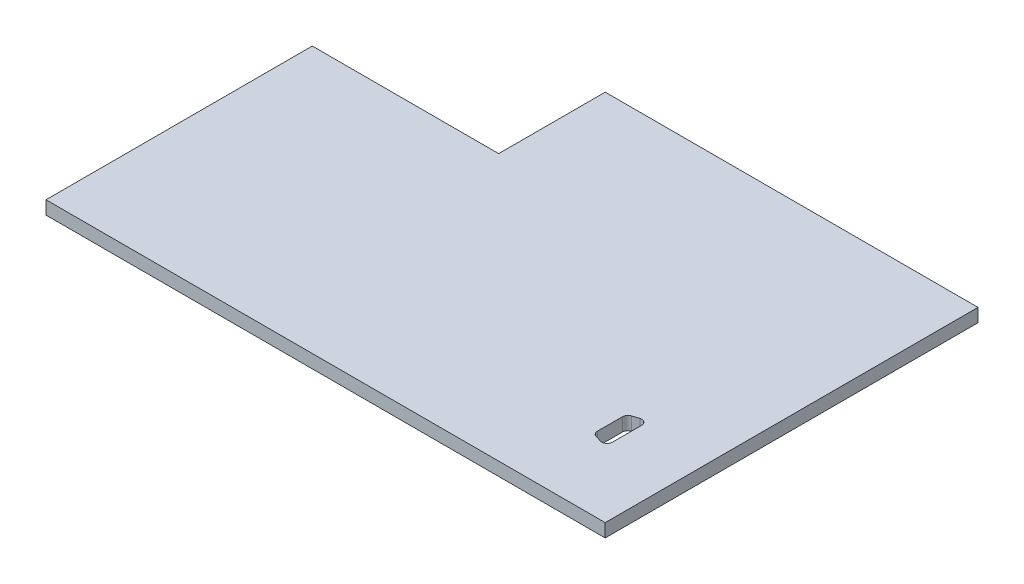
ISO-10303-21;
HEADER;
FILE_DESCRIPTION(('STEP AP214'),'2;1');
FILE_NAME('part.step','',(''),(''),'','','');
FILE_SCHEMA(('AUTOMOTIVE_DESIGN { 1 0 10303 214 1 1 1 1 }'));
ENDSEC;
DATA;
#1=APPLICATION_CONTEXT('core data for automotive mechanical design processes');
#2=APPLICATION_PROTOCOL_DEFINITION('international standard','automotive_design',2000,#1);
#3=PRODUCT_CONTEXT('',#1,'mechanical');
#4=PRODUCT('Part','Part','',(#3));
#5=PRODUCT_RELATED_PRODUCT_CATEGORY('part','',(#4));
#6=PRODUCT_DEFINITION_FORMATION('','',#4);
#7=PRODUCT_DEFINITION_CONTEXT('part definition',#1,'design');
#8=PRODUCT_DEFINITION('design','',#6,#7);
#9=PRODUCT_DEFINITION_SHAPE('','',#8);
#10=(LENGTH_UNIT() NAMED_UNIT(*) SI_UNIT(.MILLI.,.METRE.));
#11=(NAMED_UNIT(*) PLANE_ANGLE_UNIT() SI_UNIT($,.RADIAN.));
#12=(NAMED_UNIT(*) SI_UNIT($,.STERADIAN.) SOLID_ANGLE_UNIT());
#13=UNCERTAINTY_MEASURE_WITH_UNIT(LENGTH_MEASURE(1.E-05),#10,'distance_accuracy_value','');
#14=(GEOMETRIC_REPRESENTATION_CONTEXT(3) GLOBAL_UNCERTAINTY_ASSIGNED_CONTEXT((#13)) GLOBAL_UNIT_ASSIGNED_CONTEXT((#10,
#11,#12)) REPRESENTATION_CONTEXT('',''));
#15=CARTESIAN_POINT('',(0.,0.,0.));
#16=DIRECTION('',(0.,0.,1.));
#17=DIRECTION('',(1.,0.,0.));
#18=AXIS2_PLACEMENT_3D('',#15,#16,#17);
#19=CARTESIAN_POINT('',(266.7,6.35,0.));
#20=DIRECTION('',(0.,0.,-1.));
#21=DIRECTION('',(-1.,0.,0.));
#22=AXIS2_PLACEMENT_3D('',#19,#20,#21);
#23=PLANE('',#22);
#24=DIRECTION('',(1.,0.,0.));
#25=VECTOR('',#24,1.);
#26=CARTESIAN_POINT('',(266.7,0.,0.));
#27=LINE('',#26,#25);
#28=CARTESIAN_POINT('',(0.,0.,0.));
#29=VERTEX_POINT('',#28);
#30=CARTESIAN_POINT('',(266.7,0.,0.));
#31=VERTEX_POINT('',#30);
#32=EDGE_CURVE('E207',#29,#31,#27,.T.);
#33=ORIENTED_EDGE('',*,*,#32,.T.);
#34=DIRECTION('',(0.,-1.,0.));
#35=VECTOR('',#34,1.);
#36=CARTESIAN_POINT('',(266.7,6.35,0.));
#37=LINE('',#36,#35);
#38=CARTESIAN_POINT('',(266.7,6.35,0.));
#39=VERTEX_POINT('',#38);
#40=EDGE_CURVE('E255',#39,#31,#37,.T.);
#41=ORIENTED_EDGE('',*,*,#40,.F.);
#42=DIRECTION('',(1.,0.,0.));
#43=VECTOR('',#42,1.);
#44=CARTESIAN_POINT('',(266.7,6.35,0.));
#45=LINE('',#44,#43);
#46=CARTESIAN_POINT('',(0.,6.35,0.));
#47=VERTEX_POINT('',#46);
#48=EDGE_CURVE('E215',#47,#39,#45,.T.);
#49=ORIENTED_EDGE('',*,*,#48,.F.);
#50=DIRECTION('',(0.,-1.,0.));
#51=VECTOR('',#50,1.);
#52=CARTESIAN_POINT('',(0.,6.35,0.));
#53=LINE('',#52,#51);
#54=EDGE_CURVE('E229',#47,#29,#53,.T.);
#55=ORIENTED_EDGE('',*,*,#54,.T.);
#56=EDGE_LOOP('',(#33,#41,#49,#55));
#57=FACE_BOUND('',#56,.T.);
#58=ADVANCED_FACE('F33',(#57),#23,.F.);
#59=CARTESIAN_POINT('',(266.7,6.35,-177.8));
#60=DIRECTION('',(-1.,0.,0.));
#61=DIRECTION('',(0.,0.,1.));
#62=AXIS2_PLACEMENT_3D('',#59,#60,#61);
#63=PLANE('',#62);
#64=DIRECTION('',(0.,0.,-1.));
#65=VECTOR('',#64,1.);
#66=CARTESIAN_POINT('',(266.7,0.,-177.8));
#67=LINE('',#66,#65);
#68=CARTESIAN_POINT('',(266.7,0.,-177.8));
#69=VERTEX_POINT('',#68);
#70=EDGE_CURVE('E232',#31,#69,#67,.T.);
#71=ORIENTED_EDGE('',*,*,#70,.T.);
#72=DIRECTION('',(0.,-1.,0.));
#73=VECTOR('',#72,1.);
#74=CARTESIAN_POINT('',(266.7,6.35,-177.8));
#75=LINE('',#74,#73);
#76=CARTESIAN_POINT('',(266.7,6.35,-177.8));
#77=VERTEX_POINT('',#76);
#78=EDGE_CURVE('E252',#77,#69,#75,.T.);
#79=ORIENTED_EDGE('',*,*,#78,.F.);
#80=DIRECTION('',(0.,0.,-1.));
#81=VECTOR('',#80,1.);
#82=CARTESIAN_POINT('',(266.7,6.35,-177.8));
#83=LINE('',#82,#81);
#84=EDGE_CURVE('E218',#39,#77,#83,.T.);
#85=ORIENTED_EDGE('',*,*,#84,.F.);
#86=ORIENTED_EDGE('',*,*,#40,.T.);
#87=EDGE_LOOP('',(#71,#79,#85,#86));
#88=FACE_BOUND('',#87,.T.);
#89=ADVANCED_FACE('F331',(#88),#63,.F.);
#90=CARTESIAN_POINT('',(88.9,6.35,-177.8));
#91=DIRECTION('',(0.,0.,1.));
#92=DIRECTION('',(1.,0.,0.));
#93=AXIS2_PLACEMENT_3D('',#90,#91,#92);
#94=PLANE('',#93);
#95=DIRECTION('',(-1.,0.,0.));
#96=VECTOR('',#95,1.);
#97=CARTESIAN_POINT('',(88.9,0.,-177.8));
#98=LINE('',#97,#96);
#99=CARTESIAN_POINT('',(88.9,0.,-177.8));
#100=VERTEX_POINT('',#99);
#101=EDGE_CURVE('E234',#69,#100,#98,.T.);
#102=ORIENTED_EDGE('',*,*,#101,.T.);
#103=DIRECTION('',(0.,-1.,0.));
#104=VECTOR('',#103,1.);
#105=CARTESIAN_POINT('',(88.9,6.35,-177.8));
#106=LINE('',#105,#104);
#107=CARTESIAN_POINT('',(88.9,6.35,-177.8));
#108=VERTEX_POINT('',#107);
#109=EDGE_CURVE('E249',#108,#100,#106,.T.);
#110=ORIENTED_EDGE('',*,*,#109,.F.);
#111=DIRECTION('',(-1.,0.,0.));
#112=VECTOR('',#111,1.);
#113=CARTESIAN_POINT('',(88.9,6.35,-177.8));
#114=LINE('',#113,#112);
#115=EDGE_CURVE('E221',#77,#108,#114,.T.);
#116=ORIENTED_EDGE('',*,*,#115,.F.);
#117=ORIENTED_EDGE('',*,*,#78,.T.);
#118=EDGE_LOOP('',(#102,#110,#116,#117));
#119=FACE_BOUND('',#118,.T.);
#120=ADVANCED_FACE('F337',(#119),#94,.F.);
#121=CARTESIAN_POINT('',(88.9,6.35,-127.));
#122=DIRECTION('',(1.,0.,0.));
#123=DIRECTION('',(0.,0.,-1.));
#124=AXIS2_PLACEMENT_3D('',#121,#122,#123);
#125=PLANE('',#124);
#126=DIRECTION('',(0.,0.,1.));
#127=VECTOR('',#126,1.);
#128=CARTESIAN_POINT('',(88.9,0.,-127.));
#129=LINE('',#128,#127);
#130=CARTESIAN_POINT('',(88.9,0.,-158.75));
#131=VERTEX_POINT('',#130);
#132=EDGE_CURVE('E236',#100,#131,#129,.T.);
#133=ORIENTED_EDGE('',*,*,#132,.T.);
#134=DIRECTION('',(0.,1.,0.));
#135=VECTOR('',#134,1.);
#136=CARTESIAN_POINT('',(88.9,-5.08,-158.75));
#137=LINE('',#136,#135);
#138=CARTESIAN_POINT('',(88.9,-5.08,-158.75));
#139=VERTEX_POINT('',#138);
#140=EDGE_CURVE('E208',#139,#131,#137,.T.);
#141=ORIENTED_EDGE('',*,*,#140,.F.);
#142=DIRECTION('',(0.,0.,1.));
#143=VECTOR('',#142,1.);
#144=CARTESIAN_POINT('',(88.9,-5.08,-127.));
#145=LINE('',#144,#143);
#146=CARTESIAN_POINT('',(88.9,-5.08,-127.));
#147=VERTEX_POINT('',#146);
#148=EDGE_CURVE('E202',#139,#147,#145,.T.);
#149=ORIENTED_EDGE('',*,*,#148,.T.);
#150=DIRECTION('',(0.,-1.,0.));
#151=VECTOR('',#150,1.);
#152=CARTESIAN_POINT('',(88.9,6.35,-127.));
#153=LINE('',#152,#151);
#154=CARTESIAN_POINT('',(88.9,6.35,-127.));
#155=VERTEX_POINT('',#154);
#156=EDGE_CURVE('E247',#155,#147,#153,.T.);
#157=ORIENTED_EDGE('',*,*,#156,.F.);
#158=DIRECTION('',(0.,0.,1.));
#159=VECTOR('',#158,1.);
#160=CARTESIAN_POINT('',(88.9,6.35,-127.));
#161=LINE('',#160,#159);
#162=EDGE_CURVE('E223',#108,#155,#161,.T.);
#163=ORIENTED_EDGE('',*,*,#162,.F.);
#164=ORIENTED_EDGE('',*,*,#109,.T.);
#165=EDGE_LOOP('',(#133,#141,#149,#157,#163,#164));
#166=FACE_BOUND('',#165,.T.);
#167=ADVANCED_FACE('F406',(#166),#125,.F.);
#168=CARTESIAN_POINT('',(0.,6.35,-127.));
#169=DIRECTION('',(0.,0.,1.));
#170=DIRECTION('',(1.,0.,0.));
#171=AXIS2_PLACEMENT_3D('',#168,#169,#170);
#172=PLANE('',#171);
#173=DIRECTION('',(0.,-1.,0.));
#174=VECTOR('',#173,1.);
#175=CARTESIAN_POINT('',(0.,6.35,-127.));
#176=LINE('',#175,#174);
#177=CARTESIAN_POINT('',(0.,6.35,-127.));
#178=VERTEX_POINT('',#177);
#179=CARTESIAN_POINT('',(0.,0.,-127.));
#180=VERTEX_POINT('',#179);
#181=EDGE_CURVE('E244',#178,#180,#176,.T.);
#182=ORIENTED_EDGE('',*,*,#181,.F.);
#183=DIRECTION('',(-1.,0.,0.));
#184=VECTOR('',#183,1.);
#185=CARTESIAN_POINT('',(0.,6.35,-127.));
#186=LINE('',#185,#184);
#187=EDGE_CURVE('E225',#155,#178,#186,.T.);
#188=ORIENTED_EDGE('',*,*,#187,.F.);
#189=ORIENTED_EDGE('',*,*,#156,.T.);
#190=DIRECTION('',(-1.,0.,0.));
#191=VECTOR('',#190,1.);
#192=CARTESIAN_POINT('',(19.05,-5.08,-127.));
#193=LINE('',#192,#191);
#194=CARTESIAN_POINT('',(19.05,-5.08,-127.));
#195=VERTEX_POINT('',#194);
#196=EDGE_CURVE('E175',#147,#195,#193,.T.);
#197=ORIENTED_EDGE('',*,*,#196,.T.);
#198=DIRECTION('',(0.,1.,0.));
#199=VECTOR('',#198,1.);
#200=CARTESIAN_POINT('',(19.05,-5.08,-127.));
#201=LINE('',#200,#199);
#202=CARTESIAN_POINT('',(19.05,0.,-127.));
#203=VERTEX_POINT('',#202);
#204=EDGE_CURVE('E190',#195,#203,#201,.T.);
#205=ORIENTED_EDGE('',*,*,#204,.T.);
#206=DIRECTION('',(-1.,0.,0.));
#207=VECTOR('',#206,1.);
#208=CARTESIAN_POINT('',(0.,0.,-127.));
#209=LINE('',#208,#207);
#210=EDGE_CURVE('E239',#203,#180,#209,.T.);
#211=ORIENTED_EDGE('',*,*,#210,.T.);
#212=EDGE_LOOP('',(#182,#188,#189,#197,#205,#211));
#213=FACE_BOUND('',#212,.T.);
#214=ADVANCED_FACE('F402',(#213),#172,.F.);
#215=CARTESIAN_POINT('',(0.,6.35,0.));
#216=DIRECTION('',(1.,0.,0.));
#217=DIRECTION('',(0.,0.,-1.));
#218=AXIS2_PLACEMENT_3D('',#215,#216,#217);
#219=PLANE('',#218);
#220=DIRECTION('',(0.,0.,1.));
#221=VECTOR('',#220,1.);
#222=CARTESIAN_POINT('',(0.,0.,0.));
#223=LINE('',#222,#221);
#224=EDGE_CURVE('E219',#180,#29,#223,.T.);
#225=ORIENTED_EDGE('',*,*,#224,.T.);
#226=ORIENTED_EDGE('',*,*,#54,.F.);
#227=DIRECTION('',(0.,0.,1.));
#228=VECTOR('',#227,1.);
#229=CARTESIAN_POINT('',(0.,6.35,0.));
#230=LINE('',#229,#228);
#231=EDGE_CURVE('E227',#178,#47,#230,.T.);
#232=ORIENTED_EDGE('',*,*,#231,.F.);
#233=ORIENTED_EDGE('',*,*,#181,.T.);
#234=EDGE_LOOP('',(#225,#226,#232,#233));
#235=FACE_BOUND('',#234,.T.);
#236=ADVANCED_FACE('F397',(#235),#219,.F.);
#237=CARTESIAN_POINT('',(0.,6.35,0.));
#238=DIRECTION('',(0.,-1.,0.));
#239=DIRECTION('',(0.,0.,-1.));
#240=AXIS2_PLACEMENT_3D('',#237,#238,#239);
#241=PLANE('',#240);
#242=DIRECTION('',(0.,0.,-1.));
#243=VECTOR('',#242,1.);
#244=CARTESIAN_POINT('',(235.204,6.35,-31.496));
#245=LINE('',#244,#243);
#246=CARTESIAN_POINT('',(235.204,6.35,-34.9508849200106));
#247=VERTEX_POINT('',#246);
#248=CARTESIAN_POINT('',(235.204,6.35,-48.8691150799894));
#249=VERTEX_POINT('',#248);
#250=EDGE_CURVE('E355',#247,#249,#245,.T.);
#251=ORIENTED_EDGE('',*,*,#250,.F.);
#252=CARTESIAN_POINT('',(232.664,6.35,-34.9508849200106));
#253=DIRECTION('',(0.,-1.,0.));
#254=DIRECTION('',(0.,0.,-1.));
#255=AXIS2_PLACEMENT_3D('',#252,#253,#254);
#256=CIRCLE('',#255,2.54);
#257=CARTESIAN_POINT('',(231.906381517435,6.35,-32.5265057758017));
#258=VERTEX_POINT('',#257);
#259=EDGE_CURVE('E298',#247,#258,#256,.T.);
#260=ORIENTED_EDGE('',*,*,#259,.T.);
#261=DIRECTION('',(0.95447997803503,0.,0.298274993135947));
#262=VECTOR('',#261,1.);
#263=CARTESIAN_POINT('',(227.076,6.35,-34.036));
#264=LINE('',#263,#262);
#265=CARTESIAN_POINT('',(228.858381517435,6.35,-33.4790057758017));
#266=VERTEX_POINT('',#265);
#267=EDGE_CURVE('E356',#266,#258,#264,.T.);
#268=ORIENTED_EDGE('',*,*,#267,.F.);
#269=CARTESIAN_POINT('',(229.616,6.35,-35.9033849200106));
#270=DIRECTION('',(0.,-1.,0.));
#271=DIRECTION('',(0.,0.,-1.));
#272=AXIS2_PLACEMENT_3D('',#269,#270,#271);
#273=CIRCLE('',#272,2.54);
#274=CARTESIAN_POINT('',(227.076,6.35,-35.9033849200106));
#275=VERTEX_POINT('',#274);
#276=EDGE_CURVE('E302',#266,#275,#273,.T.);
#277=ORIENTED_EDGE('',*,*,#276,.T.);
#278=DIRECTION('',(0.,0.,1.));
#279=VECTOR('',#278,1.);
#280=CARTESIAN_POINT('',(227.076,6.35,-49.784));
#281=LINE('',#280,#279);
#282=CARTESIAN_POINT('',(227.076,6.35,-47.9166150799894));
#283=VERTEX_POINT('',#282);
#284=EDGE_CURVE('E191',#283,#275,#281,.T.);
#285=ORIENTED_EDGE('',*,*,#284,.F.);
#286=CARTESIAN_POINT('',(229.616,6.35,-47.9166150799894));
#287=DIRECTION('',(0.,-1.,0.));
#288=DIRECTION('',(0.,0.,-1.));
#289=AXIS2_PLACEMENT_3D('',#286,#287,#288);
#290=CIRCLE('',#289,2.54);
#291=CARTESIAN_POINT('',(228.858381517435,6.35,-50.3409942241983));
#292=VERTEX_POINT('',#291);
#293=EDGE_CURVE('E41',#283,#292,#290,.T.);
#294=ORIENTED_EDGE('',*,*,#293,.T.);
#295=DIRECTION('',(-0.95447997803503,0.,0.298274993135947));
#296=VECTOR('',#295,1.);
#297=CARTESIAN_POINT('',(235.204,6.35,-52.324));
#298=LINE('',#297,#296);
#299=CARTESIAN_POINT('',(231.906381517435,6.35,-51.2934942241983));
#300=VERTEX_POINT('',#299);
#301=EDGE_CURVE('E194',#300,#292,#298,.T.);
#302=ORIENTED_EDGE('',*,*,#301,.F.);
#303=CARTESIAN_POINT('',(232.664,6.35,-48.8691150799894));
#304=DIRECTION('',(0.,-1.,0.));
#305=DIRECTION('',(0.,0.,-1.));
#306=AXIS2_PLACEMENT_3D('',#303,#304,#305);
#307=CIRCLE('',#306,2.54);
#308=EDGE_CURVE('E55',#300,#249,#307,.T.);
#309=ORIENTED_EDGE('',*,*,#308,.T.);
#310=EDGE_LOOP('',(#251,#260,#268,#277,#285,#294,#302,#309));
#311=FACE_BOUND('',#310,.T.);
#312=ORIENTED_EDGE('',*,*,#187,.T.);
#313=ORIENTED_EDGE('',*,*,#231,.T.);
#314=ORIENTED_EDGE('',*,*,#48,.T.);
#315=ORIENTED_EDGE('',*,*,#84,.T.);
#316=ORIENTED_EDGE('',*,*,#115,.T.);
#317=ORIENTED_EDGE('',*,*,#162,.T.);
#318=EDGE_LOOP('',(#312,#313,#314,#315,#316,#317));
#319=FACE_BOUND('',#318,.T.);
#320=ADVANCED_FACE('F364',(#311,#319),#241,.F.);
#321=CARTESIAN_POINT('',(0.,0.,0.));
#322=DIRECTION('',(0.,-1.,0.));
#323=DIRECTION('',(0.,0.,-1.));
#324=AXIS2_PLACEMENT_3D('',#321,#322,#323);
#325=PLANE('',#324);
#326=DIRECTION('',(-0.95447997803503,0.,-0.298274993135947));
#327=VECTOR('',#326,1.);
#328=CARTESIAN_POINT('',(29.8924555160143,0.,-95.6558576512456));
#329=LINE('',#328,#327);
#330=CARTESIAN_POINT('',(231.906381517435,0.,-32.5265057758017));
#331=VERTEX_POINT('',#330);
#332=CARTESIAN_POINT('',(228.858381517435,0.,-33.4790057758017));
#333=VERTEX_POINT('',#332);
#334=EDGE_CURVE('E276',#331,#333,#329,.T.);
#335=ORIENTED_EDGE('',*,*,#334,.F.);
#336=CARTESIAN_POINT('',(232.664,0.,-34.9508849200106));
#337=DIRECTION('',(0.,-1.,0.));
#338=DIRECTION('',(0.,0.,-1.));
#339=AXIS2_PLACEMENT_3D('',#336,#337,#338);
#340=CIRCLE('',#339,2.54);
#341=CARTESIAN_POINT('',(235.204,0.,-34.9508849200106));
#342=VERTEX_POINT('',#341);
#343=EDGE_CURVE('E300',#331,#342,#340,.F.);
#344=ORIENTED_EDGE('',*,*,#343,.T.);
#345=DIRECTION('',(0.,0.,1.));
#346=VECTOR('',#345,1.);
#347=CARTESIAN_POINT('',(235.204,0.,0.));
#348=LINE('',#347,#346);
#349=CARTESIAN_POINT('',(235.204,0.,-48.8691150799894));
#350=VERTEX_POINT('',#349);
#351=EDGE_CURVE('E267',#350,#342,#348,.T.);
#352=ORIENTED_EDGE('',*,*,#351,.F.);
#353=CARTESIAN_POINT('',(232.664,0.,-48.8691150799894));
#354=DIRECTION('',(0.,-1.,0.));
#355=DIRECTION('',(0.,0.,-1.));
#356=AXIS2_PLACEMENT_3D('',#353,#354,#355);
#357=CIRCLE('',#356,2.54);
#358=CARTESIAN_POINT('',(231.906381517435,0.,-51.2934942241983));
#359=VERTEX_POINT('',#358);
#360=EDGE_CURVE('E307',#350,#359,#357,.F.);
#361=ORIENTED_EDGE('',*,*,#360,.T.);
#362=DIRECTION('',(0.95447997803503,0.,-0.298274993135947));
#363=VECTOR('',#362,1.);
#364=CARTESIAN_POINT('',(6.02911032028472,0.,19.2931530249111));
#365=LINE('',#364,#363);
#366=CARTESIAN_POINT('',(228.858381517435,0.,-50.3409942241983));
#367=VERTEX_POINT('',#366);
#368=EDGE_CURVE('E270',#367,#359,#365,.T.);
#369=ORIENTED_EDGE('',*,*,#368,.F.);
#370=CARTESIAN_POINT('',(229.616,0.,-47.9166150799894));
#371=DIRECTION('',(0.,-1.,0.));
#372=DIRECTION('',(0.,0.,-1.));
#373=AXIS2_PLACEMENT_3D('',#370,#371,#372);
#374=CIRCLE('',#373,2.54);
#375=CARTESIAN_POINT('',(227.076,0.,-47.9166150799894));
#376=VERTEX_POINT('',#375);
#377=EDGE_CURVE('E11',#367,#376,#374,.F.);
#378=ORIENTED_EDGE('',*,*,#377,.T.);
#379=DIRECTION('',(0.,0.,-1.));
#380=VECTOR('',#379,1.);
#381=CARTESIAN_POINT('',(227.076,0.,0.));
#382=LINE('',#381,#380);
#383=CARTESIAN_POINT('',(227.076,0.,-35.9033849200106));
#384=VERTEX_POINT('',#383);
#385=EDGE_CURVE('E273',#384,#376,#382,.T.);
#386=ORIENTED_EDGE('',*,*,#385,.F.);
#387=CARTESIAN_POINT('',(229.616,0.,-35.9033849200106));
#388=DIRECTION('',(0.,-1.,0.));
#389=DIRECTION('',(0.,0.,-1.));
#390=AXIS2_PLACEMENT_3D('',#387,#388,#389);
#391=CIRCLE('',#390,2.54);
#392=EDGE_CURVE('E304',#384,#333,#391,.F.);
#393=ORIENTED_EDGE('',*,*,#392,.T.);
#394=EDGE_LOOP('',(#335,#344,#352,#361,#369,#378,#386,#393));
#395=FACE_BOUND('',#394,.T.);
#396=DIRECTION('',(0.,0.,-1.));
#397=VECTOR('',#396,1.);
#398=CARTESIAN_POINT('',(19.05,0.,0.));
#399=LINE('',#398,#397);
#400=CARTESIAN_POINT('',(19.05,0.,-114.3));
#401=VERTEX_POINT('',#400);
#402=EDGE_CURVE('E265',#401,#203,#399,.T.);
#403=ORIENTED_EDGE('',*,*,#402,.F.);
#404=DIRECTION('',(-1.,0.,0.));
#405=VECTOR('',#404,1.);
#406=CARTESIAN_POINT('',(0.,0.,-114.3));
#407=LINE('',#406,#405);
#408=CARTESIAN_POINT('',(101.6,0.,-114.3));
#409=VERTEX_POINT('',#408);
#410=EDGE_CURVE('E170',#409,#401,#407,.T.);
#411=ORIENTED_EDGE('',*,*,#410,.F.);
#412=DIRECTION('',(0.,0.,1.));
#413=VECTOR('',#412,1.);
#414=CARTESIAN_POINT('',(101.6,0.,0.));
#415=LINE('',#414,#413);
#416=CARTESIAN_POINT('',(101.6,0.,-158.75));
#417=VERTEX_POINT('',#416);
#418=EDGE_CURVE('E259',#417,#409,#415,.T.);
#419=ORIENTED_EDGE('',*,*,#418,.F.);
#420=DIRECTION('',(1.,0.,0.));
#421=VECTOR('',#420,1.);
#422=CARTESIAN_POINT('',(0.,0.,-158.75));
#423=LINE('',#422,#421);
#424=EDGE_CURVE('E262',#131,#417,#423,.T.);
#425=ORIENTED_EDGE('',*,*,#424,.F.);
#426=ORIENTED_EDGE('',*,*,#132,.F.);
#427=ORIENTED_EDGE('',*,*,#101,.F.);
#428=ORIENTED_EDGE('',*,*,#70,.F.);
#429=ORIENTED_EDGE('',*,*,#32,.F.);
#430=ORIENTED_EDGE('',*,*,#224,.F.);
#431=ORIENTED_EDGE('',*,*,#210,.F.);
#432=EDGE_LOOP('',(#403,#411,#419,#425,#426,#427,#428,#429,#430,#431));
#433=FACE_BOUND('',#432,.T.);
#434=ADVANCED_FACE('F313',(#395,#433),#325,.T.);
#435=CARTESIAN_POINT('',(19.05,-5.08,-114.3));
#436=DIRECTION('',(-1.,0.,0.));
#437=DIRECTION('',(0.,0.,1.));
#438=AXIS2_PLACEMENT_3D('',#435,#436,#437);
#439=PLANE('',#438);
#440=DIRECTION('',(0.,1.,0.));
#441=VECTOR('',#440,1.);
#442=CARTESIAN_POINT('',(19.05,-5.08,-114.3));
#443=LINE('',#442,#441);
#444=CARTESIAN_POINT('',(19.05,-5.08,-114.3));
#445=VERTEX_POINT('',#444);
#446=EDGE_CURVE('E165',#445,#401,#443,.T.);
#447=ORIENTED_EDGE('',*,*,#446,.T.);
#448=ORIENTED_EDGE('',*,*,#402,.T.);
#449=ORIENTED_EDGE('',*,*,#204,.F.);
#450=DIRECTION('',(0.,0.,1.));
#451=VECTOR('',#450,1.);
#452=CARTESIAN_POINT('',(19.05,-5.08,-114.3));
#453=LINE('',#452,#451);
#454=EDGE_CURVE('E182',#195,#445,#453,.T.);
#455=ORIENTED_EDGE('',*,*,#454,.T.);
#456=EDGE_LOOP('',(#447,#448,#449,#455));
#457=FACE_BOUND('',#456,.T.);
#458=ADVANCED_FACE('F188',(#457),#439,.T.);
#459=CARTESIAN_POINT('',(88.9,-5.08,-158.75));
#460=DIRECTION('',(0.,0.,-1.));
#461=DIRECTION('',(-1.,0.,0.));
#462=AXIS2_PLACEMENT_3D('',#459,#460,#461);
#463=PLANE('',#462);
#464=ORIENTED_EDGE('',*,*,#140,.T.);
#465=ORIENTED_EDGE('',*,*,#424,.T.);
#466=DIRECTION('',(0.,1.,0.));
#467=VECTOR('',#466,1.);
#468=CARTESIAN_POINT('',(101.6,-5.08,-158.75));
#469=LINE('',#468,#467);
#470=CARTESIAN_POINT('',(101.6,-5.08,-158.75));
#471=VERTEX_POINT('',#470);
#472=EDGE_CURVE('E211',#471,#417,#469,.T.);
#473=ORIENTED_EDGE('',*,*,#472,.F.);
#474=DIRECTION('',(-1.,0.,0.));
#475=VECTOR('',#474,1.);
#476=CARTESIAN_POINT('',(88.9,-5.08,-158.75));
#477=LINE('',#476,#475);
#478=EDGE_CURVE('E199',#471,#139,#477,.T.);
#479=ORIENTED_EDGE('',*,*,#478,.T.);
#480=EDGE_LOOP('',(#464,#465,#473,#479));
#481=FACE_BOUND('',#480,.T.);
#482=ADVANCED_FACE('F383',(#481),#463,.T.);
#483=CARTESIAN_POINT('',(101.6,-5.08,-114.3));
#484=DIRECTION('',(1.,0.,0.));
#485=DIRECTION('',(0.,0.,-1.));
#486=AXIS2_PLACEMENT_3D('',#483,#484,#485);
#487=PLANE('',#486);
#488=ORIENTED_EDGE('',*,*,#472,.T.);
#489=ORIENTED_EDGE('',*,*,#418,.T.);
#490=DIRECTION('',(0.,1.,0.));
#491=VECTOR('',#490,1.);
#492=CARTESIAN_POINT('',(101.6,-5.08,-114.3));
#493=LINE('',#492,#491);
#494=CARTESIAN_POINT('',(101.6,-5.08,-114.3));
#495=VERTEX_POINT('',#494);
#496=EDGE_CURVE('E174',#495,#409,#493,.T.);
#497=ORIENTED_EDGE('',*,*,#496,.F.);
#498=DIRECTION('',(0.,0.,-1.));
#499=VECTOR('',#498,1.);
#500=CARTESIAN_POINT('',(101.6,-5.08,-114.3));
#501=LINE('',#500,#499);
#502=EDGE_CURVE('E186',#495,#471,#501,.T.);
#503=ORIENTED_EDGE('',*,*,#502,.T.);
#504=EDGE_LOOP('',(#488,#489,#497,#503));
#505=FACE_BOUND('',#504,.T.);
#506=ADVANCED_FACE('F386',(#505),#487,.T.);
#507=CARTESIAN_POINT('',(19.05,-5.08,-114.3));
#508=DIRECTION('',(0.,0.,1.));
#509=DIRECTION('',(1.,0.,0.));
#510=AXIS2_PLACEMENT_3D('',#507,#508,#509);
#511=PLANE('',#510);
#512=ORIENTED_EDGE('',*,*,#496,.T.);
#513=ORIENTED_EDGE('',*,*,#410,.T.);
#514=ORIENTED_EDGE('',*,*,#446,.F.);
#515=DIRECTION('',(1.,0.,0.));
#516=VECTOR('',#515,1.);
#517=CARTESIAN_POINT('',(19.05,-5.08,-114.3));
#518=LINE('',#517,#516);
#519=EDGE_CURVE('E169',#445,#495,#518,.T.);
#520=ORIENTED_EDGE('',*,*,#519,.T.);
#521=EDGE_LOOP('',(#512,#513,#514,#520));
#522=FACE_BOUND('',#521,.T.);
#523=ADVANCED_FACE('F168',(#522),#511,.T.);
#524=CARTESIAN_POINT('',(0.,-5.08,0.));
#525=DIRECTION('',(0.,-1.,0.));
#526=DIRECTION('',(0.,0.,-1.));
#527=AXIS2_PLACEMENT_3D('',#524,#525,#526);
#528=PLANE('',#527);
#529=ORIENTED_EDGE('',*,*,#454,.F.);
#530=ORIENTED_EDGE('',*,*,#196,.F.);
#531=ORIENTED_EDGE('',*,*,#148,.F.);
#532=ORIENTED_EDGE('',*,*,#478,.F.);
#533=ORIENTED_EDGE('',*,*,#502,.F.);
#534=ORIENTED_EDGE('',*,*,#519,.F.);
#535=EDGE_LOOP('',(#529,#530,#531,#532,#533,#534));
#536=FACE_BOUND('',#535,.T.);
#537=ADVANCED_FACE('F180',(#536),#528,.T.);
#538=CARTESIAN_POINT('',(227.076,-6.35,-34.036));
#539=DIRECTION('',(-0.298274993135947,0.,0.95447997803503));
#540=DIRECTION('',(0.95447997803503,0.,0.298274993135947));
#541=AXIS2_PLACEMENT_3D('',#538,#539,#540);
#542=PLANE('',#541);
#543=ORIENTED_EDGE('',*,*,#267,.T.);
#544=DIRECTION('',(0.,1.,0.));
#545=VECTOR('',#544,1.);
#546=CARTESIAN_POINT('',(231.906381517435,0.,-32.5265057758017));
#547=LINE('',#546,#545);
#548=EDGE_CURVE('E287',#258,#331,#547,.F.);
#549=ORIENTED_EDGE('',*,*,#548,.T.);
#550=ORIENTED_EDGE('',*,*,#334,.T.);
#551=DIRECTION('',(0.,1.,0.));
#552=VECTOR('',#551,1.);
#553=CARTESIAN_POINT('',(228.858381517435,6.35,-33.4790057758017));
#554=LINE('',#553,#552);
#555=EDGE_CURVE('E284',#333,#266,#554,.T.);
#556=ORIENTED_EDGE('',*,*,#555,.T.);
#557=EDGE_LOOP('',(#543,#549,#550,#556));
#558=FACE_BOUND('',#557,.T.);
#559=ADVANCED_FACE('F362',(#558),#542,.F.);
#560=CARTESIAN_POINT('',(227.076,-6.35,-49.784));
#561=DIRECTION('',(-1.,0.,0.));
#562=DIRECTION('',(0.,0.,1.));
#563=AXIS2_PLACEMENT_3D('',#560,#561,#562);
#564=PLANE('',#563);
#565=ORIENTED_EDGE('',*,*,#284,.T.);
#566=DIRECTION('',(0.,1.,0.));
#567=VECTOR('',#566,1.);
#568=CARTESIAN_POINT('',(227.076,0.,-35.9033849200106));
#569=LINE('',#568,#567);
#570=EDGE_CURVE('E292',#275,#384,#569,.F.);
#571=ORIENTED_EDGE('',*,*,#570,.T.);
#572=ORIENTED_EDGE('',*,*,#385,.T.);
#573=DIRECTION('',(0.,1.,0.));
#574=VECTOR('',#573,1.);
#575=CARTESIAN_POINT('',(227.076,6.35,-47.9166150799894));
#576=LINE('',#575,#574);
#577=EDGE_CURVE('E289',#376,#283,#576,.T.);
#578=ORIENTED_EDGE('',*,*,#577,.T.);
#579=EDGE_LOOP('',(#565,#571,#572,#578));
#580=FACE_BOUND('',#579,.T.);
#581=ADVANCED_FACE('F368',(#580),#564,.F.);
#582=CARTESIAN_POINT('',(235.204,-6.35,-52.324));
#583=DIRECTION('',(-0.298274993135947,0.,-0.95447997803503));
#584=DIRECTION('',(-0.95447997803503,0.,0.298274993135947));
#585=AXIS2_PLACEMENT_3D('',#582,#583,#584);
#586=PLANE('',#585);
#587=ORIENTED_EDGE('',*,*,#368,.T.);
#588=DIRECTION('',(0.,1.,0.));
#589=VECTOR('',#588,1.);
#590=CARTESIAN_POINT('',(231.906381517435,6.35,-51.2934942241983));
#591=LINE('',#590,#589);
#592=EDGE_CURVE('E296',#359,#300,#591,.T.);
#593=ORIENTED_EDGE('',*,*,#592,.T.);
#594=ORIENTED_EDGE('',*,*,#301,.T.);
#595=DIRECTION('',(0.,1.,0.));
#596=VECTOR('',#595,1.);
#597=CARTESIAN_POINT('',(228.858381517435,0.,-50.3409942241983));
#598=LINE('',#597,#596);
#599=EDGE_CURVE('E294',#292,#367,#598,.F.);
#600=ORIENTED_EDGE('',*,*,#599,.T.);
#601=EDGE_LOOP('',(#587,#593,#594,#600));
#602=FACE_BOUND('',#601,.T.);
#603=ADVANCED_FACE('F317',(#602),#586,.F.);
#604=CARTESIAN_POINT('',(235.204,-6.35,-31.496));
#605=DIRECTION('',(1.,0.,0.));
#606=DIRECTION('',(0.,0.,-1.));
#607=AXIS2_PLACEMENT_3D('',#604,#605,#606);
#608=PLANE('',#607);
#609=ORIENTED_EDGE('',*,*,#351,.T.);
#610=DIRECTION('',(0.,1.,0.));
#611=VECTOR('',#610,1.);
#612=CARTESIAN_POINT('',(235.204,6.35,-34.9508849200106));
#613=LINE('',#612,#611);
#614=EDGE_CURVE('E281',#342,#247,#613,.T.);
#615=ORIENTED_EDGE('',*,*,#614,.T.);
#616=ORIENTED_EDGE('',*,*,#250,.T.);
#617=DIRECTION('',(0.,1.,0.));
#618=VECTOR('',#617,1.);
#619=CARTESIAN_POINT('',(235.204,0.,-48.8691150799894));
#620=LINE('',#619,#618);
#621=EDGE_CURVE('E279',#249,#350,#620,.F.);
#622=ORIENTED_EDGE('',*,*,#621,.T.);
#623=EDGE_LOOP('',(#609,#615,#616,#622));
#624=FACE_BOUND('',#623,.T.);
#625=ADVANCED_FACE('F343',(#624),#608,.F.);
#626=CARTESIAN_POINT('',(232.664,-6.35,-34.9508849200106));
#627=DIRECTION('',(0.,-1.,0.));
#628=DIRECTION('',(0.,0.,-1.));
#629=AXIS2_PLACEMENT_3D('',#626,#627,#628);
#630=CYLINDRICAL_SURFACE('',#629,2.54);
#631=ORIENTED_EDGE('',*,*,#343,.F.);
#632=ORIENTED_EDGE('',*,*,#548,.F.);
#633=ORIENTED_EDGE('',*,*,#259,.F.);
#634=ORIENTED_EDGE('',*,*,#614,.F.);
#635=EDGE_LOOP('',(#631,#632,#633,#634));
#636=FACE_BOUND('',#635,.T.);
#637=ADVANCED_FACE('F327',(#636),#630,.F.);
#638=CARTESIAN_POINT('',(229.616,-6.35,-35.9033849200106));
#639=DIRECTION('',(0.,-1.,0.));
#640=DIRECTION('',(0.,0.,-1.));
#641=AXIS2_PLACEMENT_3D('',#638,#639,#640);
#642=CYLINDRICAL_SURFACE('',#641,2.54);
#643=ORIENTED_EDGE('',*,*,#392,.F.);
#644=ORIENTED_EDGE('',*,*,#570,.F.);
#645=ORIENTED_EDGE('',*,*,#276,.F.);
#646=ORIENTED_EDGE('',*,*,#555,.F.);
#647=EDGE_LOOP('',(#643,#644,#645,#646));
#648=FACE_BOUND('',#647,.T.);
#649=ADVANCED_FACE('F321',(#648),#642,.F.);
#650=CARTESIAN_POINT('',(232.664,-6.35,-48.8691150799894));
#651=DIRECTION('',(0.,-1.,0.));
#652=DIRECTION('',(0.,0.,-1.));
#653=AXIS2_PLACEMENT_3D('',#650,#651,#652);
#654=CYLINDRICAL_SURFACE('',#653,2.54);
#655=ORIENTED_EDGE('',*,*,#360,.F.);
#656=ORIENTED_EDGE('',*,*,#621,.F.);
#657=ORIENTED_EDGE('',*,*,#308,.F.);
#658=ORIENTED_EDGE('',*,*,#592,.F.);
#659=EDGE_LOOP('',(#655,#656,#657,#658));
#660=FACE_BOUND('',#659,.T.);
#661=ADVANCED_FACE('F319',(#660),#654,.F.);
#662=CARTESIAN_POINT('',(229.616,-6.35,-47.9166150799894));
#663=DIRECTION('',(0.,-1.,0.));
#664=DIRECTION('',(0.,0.,-1.));
#665=AXIS2_PLACEMENT_3D('',#662,#663,#664);
#666=CYLINDRICAL_SURFACE('',#665,2.54);
#667=ORIENTED_EDGE('',*,*,#377,.F.);
#668=ORIENTED_EDGE('',*,*,#599,.F.);
#669=ORIENTED_EDGE('',*,*,#293,.F.);
#670=ORIENTED_EDGE('',*,*,#577,.F.);
#671=EDGE_LOOP('',(#667,#668,#669,#670));
#672=FACE_BOUND('',#671,.T.);
#673=ADVANCED_FACE('F35',(#672),#666,.F.);
#674=CLOSED_SHELL('',(#58,#89,#120,#167,#214,#236,#320,#434,#458,#482,#506,#523,#537,#559,#581,
#603,#625,#637,#649,#661,#673));
#675=MANIFOLD_SOLID_BREP('B2',#674);
#676=ADVANCED_BREP_SHAPE_REPRESENTATION('',(#18,#675),#14);
#677=SHAPE_DEFINITION_REPRESENTATION(#9,#676);
ENDSEC;
END-ISO-10303-21;
